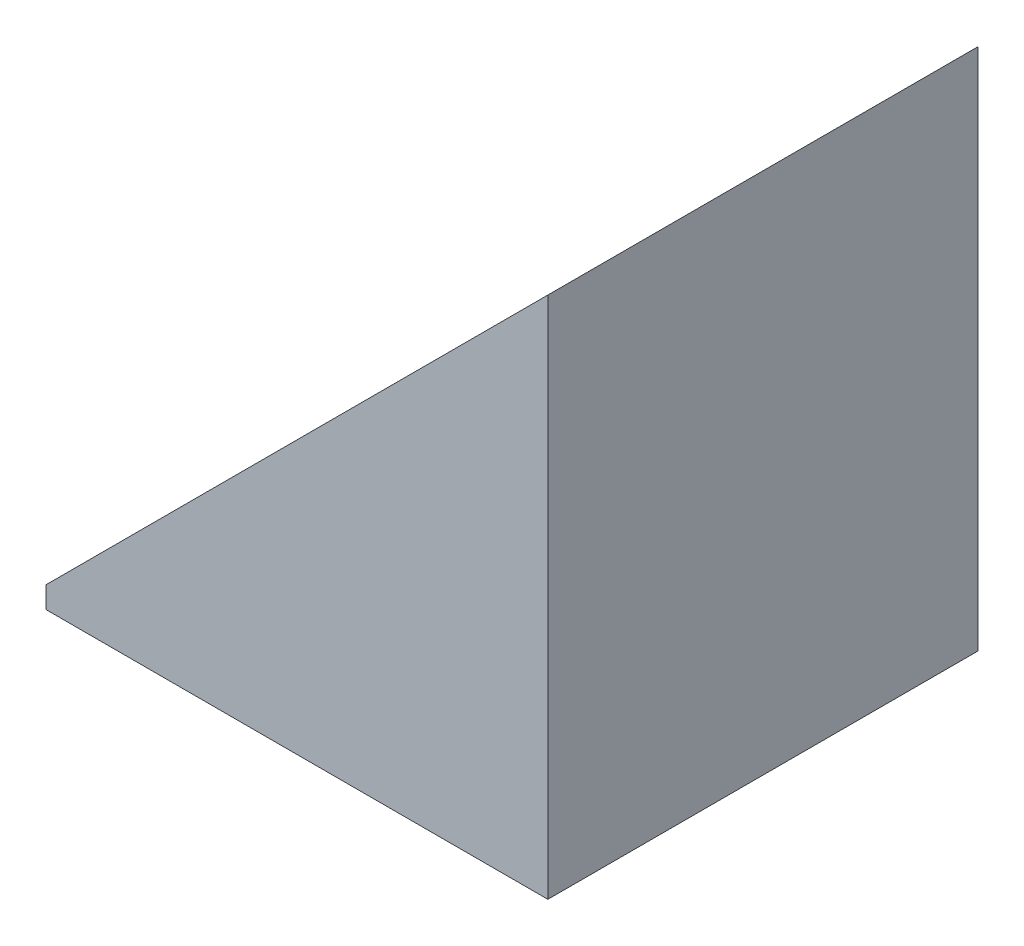
ISO-10303-21;
HEADER;
FILE_DESCRIPTION(('STEP AP214'),'2;1');
FILE_NAME('part.step','',(''),(''),'','','');
FILE_SCHEMA(('AUTOMOTIVE_DESIGN { 1 0 10303 214 1 1 1 1 }'));
ENDSEC;
DATA;
#1=APPLICATION_CONTEXT('core data for automotive mechanical design processes');
#2=APPLICATION_PROTOCOL_DEFINITION('international standard','automotive_design',2000,#1);
#3=PRODUCT_CONTEXT('',#1,'mechanical');
#4=PRODUCT('Part','Part','',(#3));
#5=PRODUCT_RELATED_PRODUCT_CATEGORY('part','',(#4));
#6=PRODUCT_DEFINITION_FORMATION('','',#4);
#7=PRODUCT_DEFINITION_CONTEXT('part definition',#1,'design');
#8=PRODUCT_DEFINITION('design','',#6,#7);
#9=PRODUCT_DEFINITION_SHAPE('','',#8);
#10=(LENGTH_UNIT() NAMED_UNIT(*) SI_UNIT(.MILLI.,.METRE.));
#11=(NAMED_UNIT(*) PLANE_ANGLE_UNIT() SI_UNIT($,.RADIAN.));
#12=(NAMED_UNIT(*) SI_UNIT($,.STERADIAN.) SOLID_ANGLE_UNIT());
#13=UNCERTAINTY_MEASURE_WITH_UNIT(LENGTH_MEASURE(1.E-05),#10,'distance_accuracy_value','');
#14=(GEOMETRIC_REPRESENTATION_CONTEXT(3) GLOBAL_UNCERTAINTY_ASSIGNED_CONTEXT((#13)) GLOBAL_UNIT_ASSIGNED_CONTEXT((#10,
#11,#12)) REPRESENTATION_CONTEXT('',''));
#15=CARTESIAN_POINT('',(0.,0.,0.));
#16=DIRECTION('',(0.,0.,1.));
#17=DIRECTION('',(1.,0.,0.));
#18=AXIS2_PLACEMENT_3D('',#15,#16,#17);
#19=CARTESIAN_POINT('',(0.,2.99999999999925,60.));
#20=DIRECTION('',(1.,0.,0.));
#21=DIRECTION('',(0.,1.,0.));
#22=AXIS2_PLACEMENT_3D('',#19,#20,#21);
#23=PLANE('',#22);
#24=DIRECTION('',(0.,-1.,0.));
#25=VECTOR('',#24,1.);
#26=CARTESIAN_POINT('',(0.,2.99999999999925,0.));
#27=LINE('',#26,#25);
#28=CARTESIAN_POINT('',(0.,2.99999999999925,0.));
#29=VERTEX_POINT('',#28);
#30=CARTESIAN_POINT('',(0.,0.,0.));
#31=VERTEX_POINT('',#30);
#32=EDGE_CURVE('E107',#29,#31,#27,.T.);
#33=ORIENTED_EDGE('',*,*,#32,.T.);
#34=DIRECTION('',(0.,0.,-1.));
#35=VECTOR('',#34,1.);
#36=CARTESIAN_POINT('',(0.,0.,60.));
#37=LINE('',#36,#35);
#38=CARTESIAN_POINT('',(0.,0.,60.));
#39=VERTEX_POINT('',#38);
#40=EDGE_CURVE('E11',#39,#31,#37,.T.);
#41=ORIENTED_EDGE('',*,*,#40,.F.);
#42=DIRECTION('',(0.,-1.,0.));
#43=VECTOR('',#42,1.);
#44=CARTESIAN_POINT('',(0.,2.99999999999925,60.));
#45=LINE('',#44,#43);
#46=CARTESIAN_POINT('',(0.,2.99999999999925,60.));
#47=VERTEX_POINT('',#46);
#48=EDGE_CURVE('E94',#47,#39,#45,.T.);
#49=ORIENTED_EDGE('',*,*,#48,.F.);
#50=DIRECTION('',(0.,0.,-1.));
#51=VECTOR('',#50,1.);
#52=CARTESIAN_POINT('',(0.,2.99999999999925,60.));
#53=LINE('',#52,#51);
#54=EDGE_CURVE('E103',#47,#29,#53,.T.);
#55=ORIENTED_EDGE('',*,*,#54,.T.);
#56=EDGE_LOOP('',(#33,#41,#49,#55));
#57=FACE_BOUND('',#56,.T.);
#58=ADVANCED_FACE('F41',(#57),#23,.F.);
#59=CARTESIAN_POINT('',(0.,0.,60.));
#60=DIRECTION('',(0.,1.,0.));
#61=DIRECTION('',(0.,0.,1.));
#62=AXIS2_PLACEMENT_3D('',#59,#60,#61);
#63=PLANE('',#62);
#64=DIRECTION('',(1.,0.,0.));
#65=VECTOR('',#64,1.);
#66=CARTESIAN_POINT('',(0.,0.,0.));
#67=LINE('',#66,#65);
#68=CARTESIAN_POINT('',(70.,0.,0.));
#69=VERTEX_POINT('',#68);
#70=EDGE_CURVE('E98',#31,#69,#67,.T.);
#71=ORIENTED_EDGE('',*,*,#70,.T.);
#72=DIRECTION('',(0.,0.,-1.));
#73=VECTOR('',#72,1.);
#74=CARTESIAN_POINT('',(70.,0.,60.));
#75=LINE('',#74,#73);
#76=CARTESIAN_POINT('',(70.,0.,60.));
#77=VERTEX_POINT('',#76);
#78=EDGE_CURVE('E50',#77,#69,#75,.T.);
#79=ORIENTED_EDGE('',*,*,#78,.F.);
#80=DIRECTION('',(1.,0.,0.));
#81=VECTOR('',#80,1.);
#82=CARTESIAN_POINT('',(0.,0.,60.));
#83=LINE('',#82,#81);
#84=EDGE_CURVE('E89',#39,#77,#83,.T.);
#85=ORIENTED_EDGE('',*,*,#84,.F.);
#86=ORIENTED_EDGE('',*,*,#40,.T.);
#87=EDGE_LOOP('',(#71,#79,#85,#86));
#88=FACE_BOUND('',#87,.T.);
#89=ADVANCED_FACE('F97',(#88),#63,.F.);
#90=CARTESIAN_POINT('',(70.,0.,60.));
#91=DIRECTION('',(-1.,0.,0.));
#92=DIRECTION('',(0.,0.,1.));
#93=AXIS2_PLACEMENT_3D('',#90,#91,#92);
#94=PLANE('',#93);
#95=DIRECTION('',(0.,1.,0.));
#96=VECTOR('',#95,1.);
#97=CARTESIAN_POINT('',(70.,0.,0.));
#98=LINE('',#97,#96);
#99=CARTESIAN_POINT('',(70.,73.,0.));
#100=VERTEX_POINT('',#99);
#101=EDGE_CURVE('E76',#69,#100,#98,.T.);
#102=ORIENTED_EDGE('',*,*,#101,.T.);
#103=DIRECTION('',(0.,0.,-1.));
#104=VECTOR('',#103,1.);
#105=CARTESIAN_POINT('',(70.,73.,60.));
#106=LINE('',#105,#104);
#107=CARTESIAN_POINT('',(70.,73.,60.));
#108=VERTEX_POINT('',#107);
#109=EDGE_CURVE('E99',#108,#100,#106,.T.);
#110=ORIENTED_EDGE('',*,*,#109,.F.);
#111=DIRECTION('',(0.,1.,0.));
#112=VECTOR('',#111,1.);
#113=CARTESIAN_POINT('',(70.,0.,60.));
#114=LINE('',#113,#112);
#115=EDGE_CURVE('E92',#77,#108,#114,.T.);
#116=ORIENTED_EDGE('',*,*,#115,.F.);
#117=ORIENTED_EDGE('',*,*,#78,.T.);
#118=EDGE_LOOP('',(#102,#110,#116,#117));
#119=FACE_BOUND('',#118,.T.);
#120=ADVANCED_FACE('F101',(#119),#94,.F.);
#121=CARTESIAN_POINT('',(70.,73.,60.));
#122=DIRECTION('',(0.707106781186551,-0.707106781186544,0.));
#123=DIRECTION('',(0.707106781186544,0.707106781186551,0.));
#124=AXIS2_PLACEMENT_3D('',#121,#122,#123);
#125=PLANE('',#124);
#126=CARTESIAN_POINT('',(28.5504790487977,31.5504790487973,19.503));
#127=DIRECTION('',(0.707106781186551,-0.707106781186544,0.));
#128=DIRECTION('',(0.707106781186544,0.707106781186551,0.));
#129=AXIS2_PLACEMENT_3D('',#126,#127,#128);
#130=CIRCLE('',#129,0.850000000000001);
#131=CARTESIAN_POINT('',(29.1515198128063,32.1515198128058,19.503));
#132=VERTEX_POINT('',#131);
#133=EDGE_CURVE('E44',#132,#132,#130,.T.);
#134=ORIENTED_EDGE('',*,*,#133,.T.);
#135=EDGE_LOOP('',(#134));
#136=FACE_BOUND('',#135,.T.);
#137=CARTESIAN_POINT('',(27.4049660632755,30.4049660632751,37.391));
#138=DIRECTION('',(0.707106781186551,-0.707106781186544,0.));
#139=DIRECTION('',(0.707106781186544,0.707106781186551,0.));
#140=AXIS2_PLACEMENT_3D('',#137,#138,#139);
#141=CIRCLE('',#140,0.849999999999999);
#142=CARTESIAN_POINT('',(28.0060068272841,31.0060068272836,37.391));
#143=VERTEX_POINT('',#142);
#144=EDGE_CURVE('E121',#143,#143,#141,.T.);
#145=ORIENTED_EDGE('',*,*,#144,.T.);
#146=EDGE_LOOP('',(#145));
#147=FACE_BOUND('',#146,.T.);
#148=CARTESIAN_POINT('',(40.2750165876518,43.2750165876515,40.502));
#149=DIRECTION('',(0.707106781186551,-0.707106781186544,0.));
#150=DIRECTION('',(0.707106781186544,0.707106781186551,0.));
#151=AXIS2_PLACEMENT_3D('',#148,#149,#150);
#152=CIRCLE('',#151,0.849999999999998);
#153=CARTESIAN_POINT('',(40.8760573516604,43.8760573516601,40.502));
#154=VERTEX_POINT('',#153);
#155=EDGE_CURVE('E118',#154,#154,#152,.T.);
#156=ORIENTED_EDGE('',*,*,#155,.T.);
#157=EDGE_LOOP('',(#156));
#158=FACE_BOUND('',#157,.T.);
#159=CARTESIAN_POINT('',(43.4053783079646,46.4053783079643,23.123));
#160=DIRECTION('',(0.707106781186551,-0.707106781186544,0.));
#161=DIRECTION('',(0.707106781186544,0.707106781186551,0.));
#162=AXIS2_PLACEMENT_3D('',#159,#160,#161);
#163=CIRCLE('',#162,0.850000000000001);
#164=CARTESIAN_POINT('',(44.0064190719732,47.0064190719729,23.123));
#165=VERTEX_POINT('',#164);
#166=EDGE_CURVE('E115',#165,#165,#163,.T.);
#167=ORIENTED_EDGE('',*,*,#166,.T.);
#168=EDGE_LOOP('',(#167));
#169=FACE_BOUND('',#168,.T.);
#170=DIRECTION('',(-0.707106781186544,-0.707106781186551,0.));
#171=VECTOR('',#170,1.);
#172=CARTESIAN_POINT('',(70.,73.,0.));
#173=LINE('',#172,#171);
#174=EDGE_CURVE('E82',#100,#29,#173,.T.);
#175=ORIENTED_EDGE('',*,*,#174,.T.);
#176=ORIENTED_EDGE('',*,*,#54,.F.);
#177=DIRECTION('',(-0.707106781186544,-0.707106781186551,0.));
#178=VECTOR('',#177,1.);
#179=CARTESIAN_POINT('',(70.,73.,60.));
#180=LINE('',#179,#178);
#181=EDGE_CURVE('E59',#108,#47,#180,.T.);
#182=ORIENTED_EDGE('',*,*,#181,.F.);
#183=ORIENTED_EDGE('',*,*,#109,.T.);
#184=EDGE_LOOP('',(#175,#176,#182,#183));
#185=FACE_BOUND('',#184,.T.);
#186=ADVANCED_FACE('F128',(#136,#147,#158,#169,#185),#125,.F.);
#187=CARTESIAN_POINT('',(0.,0.,60.));
#188=DIRECTION('',(0.,0.,1.));
#189=DIRECTION('',(1.,0.,0.));
#190=AXIS2_PLACEMENT_3D('',#187,#188,#189);
#191=PLANE('',#190);
#192=ORIENTED_EDGE('',*,*,#48,.T.);
#193=ORIENTED_EDGE('',*,*,#84,.T.);
#194=ORIENTED_EDGE('',*,*,#115,.T.);
#195=ORIENTED_EDGE('',*,*,#181,.T.);
#196=EDGE_LOOP('',(#192,#193,#194,#195));
#197=FACE_BOUND('',#196,.T.);
#198=ADVANCED_FACE('F90',(#197),#191,.T.);
#199=CARTESIAN_POINT('',(0.,0.,0.));
#200=DIRECTION('',(0.,0.,1.));
#201=DIRECTION('',(1.,0.,0.));
#202=AXIS2_PLACEMENT_3D('',#199,#200,#201);
#203=PLANE('',#202);
#204=ORIENTED_EDGE('',*,*,#32,.F.);
#205=ORIENTED_EDGE('',*,*,#174,.F.);
#206=ORIENTED_EDGE('',*,*,#101,.F.);
#207=ORIENTED_EDGE('',*,*,#70,.F.);
#208=EDGE_LOOP('',(#204,#205,#206,#207));
#209=FACE_BOUND('',#208,.T.);
#210=ADVANCED_FACE('F154',(#209),#203,.F.);
#211=CARTESIAN_POINT('',(64.6185817435612,25.192174872368,23.123));
#212=DIRECTION('',(-0.707106781186551,0.707106781186544,0.));
#213=DIRECTION('',(-0.707106781186544,-0.707106781186551,0.));
#214=AXIS2_PLACEMENT_3D('',#211,#212,#213);
#215=CYLINDRICAL_SURFACE('',#214,0.850000000000001);
#216=CARTESIAN_POINT('',(64.6185817435612,25.192174872368,23.123));
#217=DIRECTION('',(-0.707106781186551,0.707106781186544,0.));
#218=DIRECTION('',(-0.707106781186544,-0.707106781186551,0.));
#219=AXIS2_PLACEMENT_3D('',#216,#217,#218);
#220=CIRCLE('',#219,0.850000000000001);
#221=CARTESIAN_POINT('',(64.0175409795526,24.5911341083595,23.123));
#222=VERTEX_POINT('',#221);
#223=EDGE_CURVE('E275',#222,#222,#220,.T.);
#224=ORIENTED_EDGE('',*,*,#223,.F.);
#225=EDGE_LOOP('',(#224));
#226=FACE_BOUND('',#225,.T.);
#227=ORIENTED_EDGE('',*,*,#166,.F.);
#228=EDGE_LOOP('',(#227));
#229=FACE_BOUND('',#228,.T.);
#230=ADVANCED_FACE('F156',(#226,#229),#215,.F.);
#231=CARTESIAN_POINT('',(64.6185817435612,25.192174872368,23.123));
#232=DIRECTION('',(-0.707106781186551,0.707106781186544,0.));
#233=DIRECTION('',(-0.707106781186544,-0.707106781186551,0.));
#234=AXIS2_PLACEMENT_3D('',#231,#232,#233);
#235=PLANE('',#234);
#236=ORIENTED_EDGE('',*,*,#223,.T.);
#237=EDGE_LOOP('',(#236));
#238=FACE_BOUND('',#237,.T.);
#239=ADVANCED_FACE('F162',(#238),#235,.T.);
#240=CARTESIAN_POINT('',(61.4882200232483,22.0618131520552,40.502));
#241=DIRECTION('',(-0.707106781186551,0.707106781186544,0.));
#242=DIRECTION('',(-0.707106781186544,-0.707106781186551,0.));
#243=AXIS2_PLACEMENT_3D('',#240,#241,#242);
#244=CYLINDRICAL_SURFACE('',#243,0.849999999999998);
#245=CARTESIAN_POINT('',(61.4882200232483,22.0618131520552,40.502));
#246=DIRECTION('',(-0.707106781186551,0.707106781186544,0.));
#247=DIRECTION('',(-0.707106781186544,-0.707106781186551,0.));
#248=AXIS2_PLACEMENT_3D('',#245,#246,#247);
#249=CIRCLE('',#248,0.849999999999998);
#250=CARTESIAN_POINT('',(60.8871792592398,21.4607723880466,40.502));
#251=VERTEX_POINT('',#250);
#252=EDGE_CURVE('E272',#251,#251,#249,.T.);
#253=ORIENTED_EDGE('',*,*,#252,.F.);
#254=EDGE_LOOP('',(#253));
#255=FACE_BOUND('',#254,.T.);
#256=ORIENTED_EDGE('',*,*,#155,.F.);
#257=EDGE_LOOP('',(#256));
#258=FACE_BOUND('',#257,.T.);
#259=ADVANCED_FACE('F208',(#255,#258),#244,.F.);
#260=CARTESIAN_POINT('',(61.4882200232483,22.0618131520552,40.502));
#261=DIRECTION('',(-0.707106781186551,0.707106781186544,0.));
#262=DIRECTION('',(-0.707106781186544,-0.707106781186551,0.));
#263=AXIS2_PLACEMENT_3D('',#260,#261,#262);
#264=PLANE('',#263);
#265=ORIENTED_EDGE('',*,*,#252,.T.);
#266=EDGE_LOOP('',(#265));
#267=FACE_BOUND('',#266,.T.);
#268=ADVANCED_FACE('F219',(#267),#264,.T.);
#269=CARTESIAN_POINT('',(48.6181694988721,9.19176262767874,37.391));
#270=DIRECTION('',(-0.707106781186551,0.707106781186544,0.));
#271=DIRECTION('',(-0.707106781186544,-0.707106781186551,0.));
#272=AXIS2_PLACEMENT_3D('',#269,#270,#271);
#273=CYLINDRICAL_SURFACE('',#272,0.849999999999999);
#274=CARTESIAN_POINT('',(48.6181694988721,9.19176262767874,37.391));
#275=DIRECTION('',(-0.707106781186551,0.707106781186544,0.));
#276=DIRECTION('',(-0.707106781186544,-0.707106781186551,0.));
#277=AXIS2_PLACEMENT_3D('',#274,#275,#276);
#278=CIRCLE('',#277,0.849999999999999);
#279=CARTESIAN_POINT('',(48.0171287348635,8.59072186367017,37.391));
#280=VERTEX_POINT('',#279);
#281=EDGE_CURVE('E271',#280,#280,#278,.T.);
#282=ORIENTED_EDGE('',*,*,#281,.F.);
#283=EDGE_LOOP('',(#282));
#284=FACE_BOUND('',#283,.T.);
#285=ORIENTED_EDGE('',*,*,#144,.F.);
#286=EDGE_LOOP('',(#285));
#287=FACE_BOUND('',#286,.T.);
#288=ADVANCED_FACE('F142',(#284,#287),#273,.F.);
#289=CARTESIAN_POINT('',(48.6181694988721,9.19176262767874,37.391));
#290=DIRECTION('',(-0.707106781186551,0.707106781186544,0.));
#291=DIRECTION('',(-0.707106781186544,-0.707106781186551,0.));
#292=AXIS2_PLACEMENT_3D('',#289,#290,#291);
#293=PLANE('',#292);
#294=ORIENTED_EDGE('',*,*,#281,.T.);
#295=EDGE_LOOP('',(#294));
#296=FACE_BOUND('',#295,.T.);
#297=ADVANCED_FACE('F133',(#296),#293,.T.);
#298=CARTESIAN_POINT('',(49.7636824843943,10.337275613201,19.503));
#299=DIRECTION('',(-0.707106781186551,0.707106781186544,0.));
#300=DIRECTION('',(-0.707106781186544,-0.707106781186551,0.));
#301=AXIS2_PLACEMENT_3D('',#298,#299,#300);
#302=CYLINDRICAL_SURFACE('',#301,0.850000000000001);
#303=CARTESIAN_POINT('',(49.7636824843943,10.337275613201,19.503));
#304=DIRECTION('',(-0.707106781186551,0.707106781186544,0.));
#305=DIRECTION('',(-0.707106781186544,-0.707106781186551,0.));
#306=AXIS2_PLACEMENT_3D('',#303,#304,#305);
#307=CIRCLE('',#306,0.850000000000001);
#308=CARTESIAN_POINT('',(49.1626417203857,9.73623484919239,19.503));
#309=VERTEX_POINT('',#308);
#310=EDGE_CURVE('E119',#309,#309,#307,.T.);
#311=ORIENTED_EDGE('',*,*,#310,.F.);
#312=EDGE_LOOP('',(#311));
#313=FACE_BOUND('',#312,.T.);
#314=ORIENTED_EDGE('',*,*,#133,.F.);
#315=EDGE_LOOP('',(#314));
#316=FACE_BOUND('',#315,.T.);
#317=ADVANCED_FACE('F130',(#313,#316),#302,.F.);
#318=CARTESIAN_POINT('',(49.7636824843943,10.337275613201,19.503));
#319=DIRECTION('',(-0.707106781186551,0.707106781186544,0.));
#320=DIRECTION('',(-0.707106781186544,-0.707106781186551,0.));
#321=AXIS2_PLACEMENT_3D('',#318,#319,#320);
#322=PLANE('',#321);
#323=ORIENTED_EDGE('',*,*,#310,.T.);
#324=EDGE_LOOP('',(#323));
#325=FACE_BOUND('',#324,.T.);
#326=ADVANCED_FACE('F132',(#325),#322,.T.);
#327=CLOSED_SHELL('',(#58,#89,#120,#186,#198,#210,#230,#239,#259,#268,#288,#297,#317,#326));
#328=MANIFOLD_SOLID_BREP('B2',#327);
#329=ADVANCED_BREP_SHAPE_REPRESENTATION('',(#18,#328),#14);
#330=SHAPE_DEFINITION_REPRESENTATION(#9,#329);
ENDSEC;
END-ISO-10303-21;
